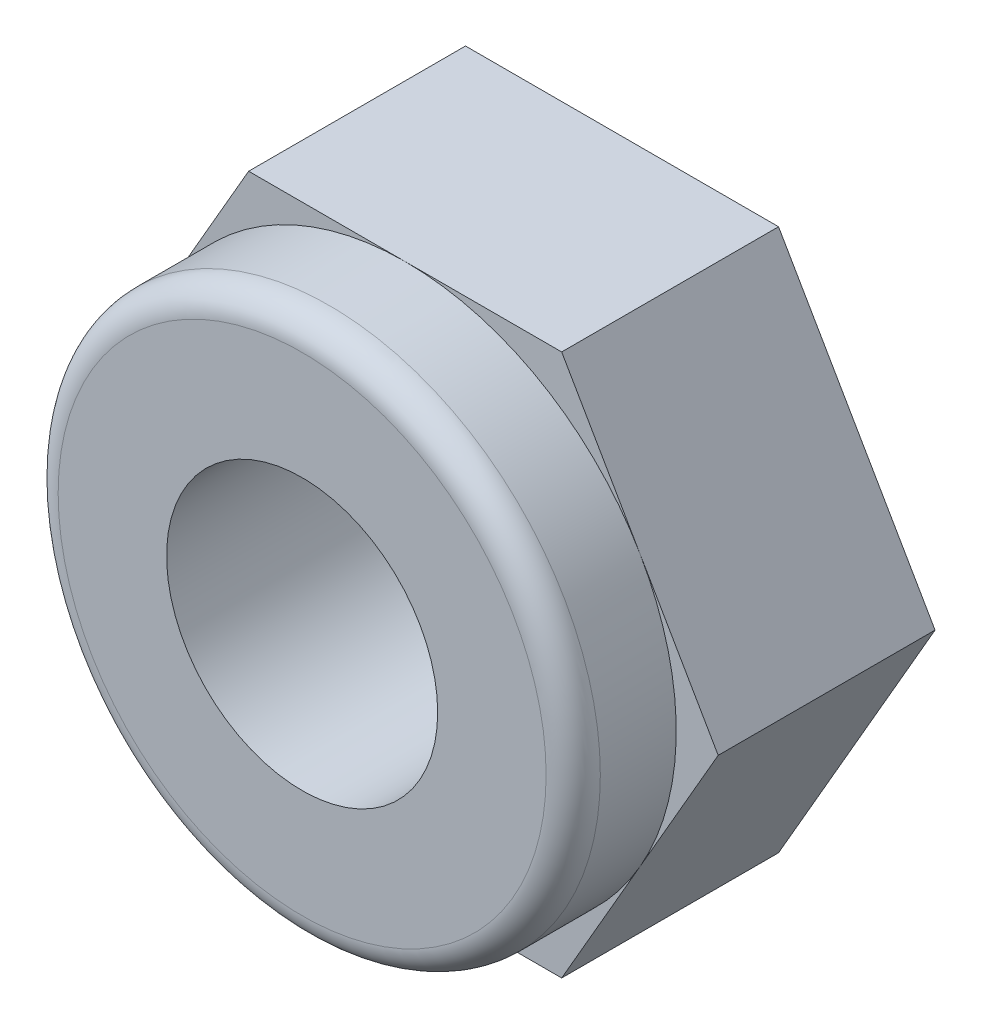
ISO-10303-21;
HEADER;
FILE_DESCRIPTION(('STEP AP214'),'2;1');
FILE_NAME('part.step','',(''),(''),'','','');
FILE_SCHEMA(('AUTOMOTIVE_DESIGN { 1 0 10303 214 1 1 1 1 }'));
ENDSEC;
DATA;
#1=APPLICATION_CONTEXT('core data for automotive mechanical design processes');
#2=APPLICATION_PROTOCOL_DEFINITION('international standard','automotive_design',2000,#1);
#3=PRODUCT_CONTEXT('',#1,'mechanical');
#4=PRODUCT('Part','Part','',(#3));
#5=PRODUCT_RELATED_PRODUCT_CATEGORY('part','',(#4));
#6=PRODUCT_DEFINITION_FORMATION('','',#4);
#7=PRODUCT_DEFINITION_CONTEXT('part definition',#1,'design');
#8=PRODUCT_DEFINITION('design','',#6,#7);
#9=PRODUCT_DEFINITION_SHAPE('','',#8);
#10=(LENGTH_UNIT() NAMED_UNIT(*) SI_UNIT(.MILLI.,.METRE.));
#11=(NAMED_UNIT(*) PLANE_ANGLE_UNIT() SI_UNIT($,.RADIAN.));
#12=(NAMED_UNIT(*) SI_UNIT($,.STERADIAN.) SOLID_ANGLE_UNIT());
#13=UNCERTAINTY_MEASURE_WITH_UNIT(LENGTH_MEASURE(1.E-05),#10,'distance_accuracy_value','');
#14=(GEOMETRIC_REPRESENTATION_CONTEXT(3) GLOBAL_UNCERTAINTY_ASSIGNED_CONTEXT((#13)) GLOBAL_UNIT_ASSIGNED_CONTEXT((#10,
#11,#12)) REPRESENTATION_CONTEXT('',''));
#15=CARTESIAN_POINT('',(0.,0.,0.));
#16=DIRECTION('',(0.,0.,1.));
#17=DIRECTION('',(1.,0.,0.));
#18=AXIS2_PLACEMENT_3D('',#15,#16,#17);
#19=CARTESIAN_POINT('',(0.,0.,4.));
#20=DIRECTION('',(0.,0.,1.));
#21=DIRECTION('',(1.,0.,0.));
#22=AXIS2_PLACEMENT_3D('',#19,#20,#21);
#23=PLANE('',#22);
#24=CARTESIAN_POINT('',(0.,0.,4.));
#25=DIRECTION('',(0.,0.,1.));
#26=DIRECTION('',(1.,0.,0.));
#27=AXIS2_PLACEMENT_3D('',#24,#25,#26);
#28=CIRCLE('',#27,5.);
#29=CARTESIAN_POINT('',(4.33012701892219,2.5,4.));
#30=VERTEX_POINT('',#29);
#31=CARTESIAN_POINT('',(0.,5.,4.));
#32=VERTEX_POINT('',#31);
#33=EDGE_CURVE('E139',#30,#32,#28,.T.);
#34=ORIENTED_EDGE('',*,*,#33,.F.);
#35=DIRECTION('',(-0.5,0.866025403784439,0.));
#36=VECTOR('',#35,1.);
#37=CARTESIAN_POINT('',(5.77350269189626,0.,4.));
#38=LINE('',#37,#36);
#39=CARTESIAN_POINT('',(2.88675134594813,5.,4.));
#40=VERTEX_POINT('',#39);
#41=EDGE_CURVE('E126',#30,#40,#38,.T.);
#42=ORIENTED_EDGE('',*,*,#41,.T.);
#43=DIRECTION('',(-1.,0.,0.));
#44=VECTOR('',#43,1.);
#45=CARTESIAN_POINT('',(2.88675134594813,5.,4.));
#46=LINE('',#45,#44);
#47=EDGE_CURVE('E140',#40,#32,#46,.T.);
#48=ORIENTED_EDGE('',*,*,#47,.T.);
#49=EDGE_LOOP('',(#34,#42,#48));
#50=FACE_BOUND('',#49,.T.);
#51=ADVANCED_FACE('F41',(#50),#23,.T.);
#52=CARTESIAN_POINT('',(-4.33012701892219,2.5,4.));
#53=VERTEX_POINT('',#52);
#54=EDGE_CURVE('E147',#32,#53,#28,.T.);
#55=ORIENTED_EDGE('',*,*,#54,.F.);
#56=CARTESIAN_POINT('',(-2.88675134594813,5.,4.));
#57=VERTEX_POINT('',#56);
#58=EDGE_CURVE('E125',#32,#57,#46,.T.);
#59=ORIENTED_EDGE('',*,*,#58,.T.);
#60=DIRECTION('',(-0.5,-0.866025403784439,0.));
#61=VECTOR('',#60,1.);
#62=CARTESIAN_POINT('',(-2.88675134594813,5.,4.));
#63=LINE('',#62,#61);
#64=EDGE_CURVE('E162',#57,#53,#63,.T.);
#65=ORIENTED_EDGE('',*,*,#64,.T.);
#66=EDGE_LOOP('',(#55,#59,#65));
#67=FACE_BOUND('',#66,.T.);
#68=ADVANCED_FACE('F229',(#67),#23,.T.);
#69=CARTESIAN_POINT('',(-4.3301270189222,-2.5,4.));
#70=VERTEX_POINT('',#69);
#71=EDGE_CURVE('E215',#53,#70,#28,.T.);
#72=ORIENTED_EDGE('',*,*,#71,.F.);
#73=CARTESIAN_POINT('',(-5.77350269189626,0.,4.));
#74=VERTEX_POINT('',#73);
#75=EDGE_CURVE('E161',#53,#74,#63,.T.);
#76=ORIENTED_EDGE('',*,*,#75,.T.);
#77=DIRECTION('',(0.5,-0.866025403784439,0.));
#78=VECTOR('',#77,1.);
#79=CARTESIAN_POINT('',(-5.77350269189626,0.,4.));
#80=LINE('',#79,#78);
#81=EDGE_CURVE('E167',#74,#70,#80,.T.);
#82=ORIENTED_EDGE('',*,*,#81,.T.);
#83=EDGE_LOOP('',(#72,#76,#82));
#84=FACE_BOUND('',#83,.T.);
#85=ADVANCED_FACE('F221',(#84),#23,.T.);
#86=CARTESIAN_POINT('',(0.,-5.,4.));
#87=VERTEX_POINT('',#86);
#88=EDGE_CURVE('E65',#70,#87,#28,.T.);
#89=ORIENTED_EDGE('',*,*,#88,.F.);
#90=CARTESIAN_POINT('',(-2.88675134594813,-5.,4.));
#91=VERTEX_POINT('',#90);
#92=EDGE_CURVE('E166',#70,#91,#80,.T.);
#93=ORIENTED_EDGE('',*,*,#92,.T.);
#94=DIRECTION('',(1.,0.,0.));
#95=VECTOR('',#94,1.);
#96=CARTESIAN_POINT('',(-2.88675134594813,-5.,4.));
#97=LINE('',#96,#95);
#98=EDGE_CURVE('E172',#91,#87,#97,.T.);
#99=ORIENTED_EDGE('',*,*,#98,.T.);
#100=EDGE_LOOP('',(#89,#93,#99));
#101=FACE_BOUND('',#100,.T.);
#102=ADVANCED_FACE('F249',(#101),#23,.T.);
#103=CARTESIAN_POINT('',(4.3301270189222,-2.5,4.));
#104=VERTEX_POINT('',#103);
#105=EDGE_CURVE('E57',#87,#104,#28,.T.);
#106=ORIENTED_EDGE('',*,*,#105,.F.);
#107=CARTESIAN_POINT('',(2.88675134594813,-5.,4.));
#108=VERTEX_POINT('',#107);
#109=EDGE_CURVE('E171',#87,#108,#97,.T.);
#110=ORIENTED_EDGE('',*,*,#109,.T.);
#111=DIRECTION('',(0.5,0.866025403784439,0.));
#112=VECTOR('',#111,1.);
#113=CARTESIAN_POINT('',(2.88675134594813,-5.,4.));
#114=LINE('',#113,#112);
#115=EDGE_CURVE('E137',#108,#104,#114,.T.);
#116=ORIENTED_EDGE('',*,*,#115,.T.);
#117=EDGE_LOOP('',(#106,#110,#116));
#118=FACE_BOUND('',#117,.T.);
#119=ADVANCED_FACE('F280',(#118),#23,.T.);
#120=CARTESIAN_POINT('',(2.88675134594813,-5.,4.));
#121=DIRECTION('',(-0.866025403784439,0.5,0.));
#122=DIRECTION('',(-0.5,-0.866025403784439,0.));
#123=AXIS2_PLACEMENT_3D('',#120,#121,#122);
#124=PLANE('',#123);
#125=DIRECTION('',(0.5,0.866025403784439,0.));
#126=VECTOR('',#125,1.);
#127=CARTESIAN_POINT('',(2.88675134594813,-5.,0.));
#128=LINE('',#127,#126);
#129=CARTESIAN_POINT('',(2.88675134594813,-5.,0.));
#130=VERTEX_POINT('',#129);
#131=CARTESIAN_POINT('',(5.77350269189626,0.,0.));
#132=VERTEX_POINT('',#131);
#133=EDGE_CURVE('E144',#130,#132,#128,.T.);
#134=ORIENTED_EDGE('',*,*,#133,.T.);
#135=DIRECTION('',(0.,0.,-1.));
#136=VECTOR('',#135,1.);
#137=CARTESIAN_POINT('',(5.77350269189626,0.,4.));
#138=LINE('',#137,#136);
#139=CARTESIAN_POINT('',(5.77350269189626,0.,4.));
#140=VERTEX_POINT('',#139);
#141=EDGE_CURVE('E150',#140,#132,#138,.T.);
#142=ORIENTED_EDGE('',*,*,#141,.F.);
#143=EDGE_CURVE('E120',#104,#140,#114,.T.);
#144=ORIENTED_EDGE('',*,*,#143,.F.);
#145=ORIENTED_EDGE('',*,*,#115,.F.);
#146=DIRECTION('',(0.,0.,-1.));
#147=VECTOR('',#146,1.);
#148=CARTESIAN_POINT('',(2.88675134594813,-5.,4.));
#149=LINE('',#148,#147);
#150=EDGE_CURVE('E175',#108,#130,#149,.T.);
#151=ORIENTED_EDGE('',*,*,#150,.T.);
#152=EDGE_LOOP('',(#134,#142,#144,#145,#151));
#153=FACE_BOUND('',#152,.T.);
#154=ADVANCED_FACE('F288',(#153),#124,.F.);
#155=CARTESIAN_POINT('',(5.77350269189626,0.,4.));
#156=DIRECTION('',(-0.866025403784439,-0.5,0.));
#157=DIRECTION('',(0.5,-0.866025403784439,0.));
#158=AXIS2_PLACEMENT_3D('',#155,#156,#157);
#159=PLANE('',#158);
#160=DIRECTION('',(-0.5,0.866025403784439,0.));
#161=VECTOR('',#160,1.);
#162=CARTESIAN_POINT('',(5.77350269189626,0.,0.));
#163=LINE('',#162,#161);
#164=CARTESIAN_POINT('',(2.88675134594813,5.,0.));
#165=VERTEX_POINT('',#164);
#166=EDGE_CURVE('E179',#132,#165,#163,.T.);
#167=ORIENTED_EDGE('',*,*,#166,.T.);
#168=DIRECTION('',(0.,0.,-1.));
#169=VECTOR('',#168,1.);
#170=CARTESIAN_POINT('',(2.88675134594813,5.,4.));
#171=LINE('',#170,#169);
#172=EDGE_CURVE('E132',#40,#165,#171,.T.);
#173=ORIENTED_EDGE('',*,*,#172,.F.);
#174=ORIENTED_EDGE('',*,*,#41,.F.);
#175=EDGE_CURVE('E114',#140,#30,#38,.T.);
#176=ORIENTED_EDGE('',*,*,#175,.F.);
#177=ORIENTED_EDGE('',*,*,#141,.T.);
#178=EDGE_LOOP('',(#167,#173,#174,#176,#177));
#179=FACE_BOUND('',#178,.T.);
#180=ADVANCED_FACE('F130',(#179),#159,.F.);
#181=CARTESIAN_POINT('',(2.88675134594813,5.,4.));
#182=DIRECTION('',(0.,-1.,0.));
#183=DIRECTION('',(0.,0.,-1.));
#184=AXIS2_PLACEMENT_3D('',#181,#182,#183);
#185=PLANE('',#184);
#186=DIRECTION('',(-1.,0.,0.));
#187=VECTOR('',#186,1.);
#188=CARTESIAN_POINT('',(2.88675134594813,5.,0.));
#189=LINE('',#188,#187);
#190=CARTESIAN_POINT('',(-2.88675134594813,5.,0.));
#191=VERTEX_POINT('',#190);
#192=EDGE_CURVE('E182',#165,#191,#189,.T.);
#193=ORIENTED_EDGE('',*,*,#192,.T.);
#194=DIRECTION('',(0.,0.,-1.));
#195=VECTOR('',#194,1.);
#196=CARTESIAN_POINT('',(-2.88675134594813,5.,4.));
#197=LINE('',#196,#195);
#198=EDGE_CURVE('E205',#57,#191,#197,.T.);
#199=ORIENTED_EDGE('',*,*,#198,.F.);
#200=ORIENTED_EDGE('',*,*,#58,.F.);
#201=ORIENTED_EDGE('',*,*,#47,.F.);
#202=ORIENTED_EDGE('',*,*,#172,.T.);
#203=EDGE_LOOP('',(#193,#199,#200,#201,#202));
#204=FACE_BOUND('',#203,.T.);
#205=ADVANCED_FACE('F234',(#204),#185,.F.);
#206=CARTESIAN_POINT('',(-2.88675134594813,5.,4.));
#207=DIRECTION('',(0.866025403784439,-0.5,0.));
#208=DIRECTION('',(0.5,0.866025403784439,0.));
#209=AXIS2_PLACEMENT_3D('',#206,#207,#208);
#210=PLANE('',#209);
#211=DIRECTION('',(-0.5,-0.866025403784439,0.));
#212=VECTOR('',#211,1.);
#213=CARTESIAN_POINT('',(-2.88675134594813,5.,0.));
#214=LINE('',#213,#212);
#215=CARTESIAN_POINT('',(-5.77350269189626,0.,0.));
#216=VERTEX_POINT('',#215);
#217=EDGE_CURVE('E185',#191,#216,#214,.T.);
#218=ORIENTED_EDGE('',*,*,#217,.T.);
#219=DIRECTION('',(0.,0.,-1.));
#220=VECTOR('',#219,1.);
#221=CARTESIAN_POINT('',(-5.77350269189626,0.,4.));
#222=LINE('',#221,#220);
#223=EDGE_CURVE('E201',#74,#216,#222,.T.);
#224=ORIENTED_EDGE('',*,*,#223,.F.);
#225=ORIENTED_EDGE('',*,*,#75,.F.);
#226=ORIENTED_EDGE('',*,*,#64,.F.);
#227=ORIENTED_EDGE('',*,*,#198,.T.);
#228=EDGE_LOOP('',(#218,#224,#225,#226,#227));
#229=FACE_BOUND('',#228,.T.);
#230=ADVANCED_FACE('F226',(#229),#210,.F.);
#231=CARTESIAN_POINT('',(-5.77350269189626,0.,4.));
#232=DIRECTION('',(0.866025403784439,0.5,0.));
#233=DIRECTION('',(-0.5,0.866025403784439,0.));
#234=AXIS2_PLACEMENT_3D('',#231,#232,#233);
#235=PLANE('',#234);
#236=DIRECTION('',(0.5,-0.866025403784439,0.));
#237=VECTOR('',#236,1.);
#238=CARTESIAN_POINT('',(-5.77350269189626,0.,0.));
#239=LINE('',#238,#237);
#240=CARTESIAN_POINT('',(-2.88675134594813,-5.,0.));
#241=VERTEX_POINT('',#240);
#242=EDGE_CURVE('E188',#216,#241,#239,.T.);
#243=ORIENTED_EDGE('',*,*,#242,.T.);
#244=DIRECTION('',(0.,0.,-1.));
#245=VECTOR('',#244,1.);
#246=CARTESIAN_POINT('',(-2.88675134594813,-5.,4.));
#247=LINE('',#246,#245);
#248=EDGE_CURVE('E197',#91,#241,#247,.T.);
#249=ORIENTED_EDGE('',*,*,#248,.F.);
#250=ORIENTED_EDGE('',*,*,#92,.F.);
#251=ORIENTED_EDGE('',*,*,#81,.F.);
#252=ORIENTED_EDGE('',*,*,#223,.T.);
#253=EDGE_LOOP('',(#243,#249,#250,#251,#252));
#254=FACE_BOUND('',#253,.T.);
#255=ADVANCED_FACE('F244',(#254),#235,.F.);
#256=CARTESIAN_POINT('',(-2.88675134594813,-5.,4.));
#257=DIRECTION('',(0.,1.,0.));
#258=DIRECTION('',(0.,0.,1.));
#259=AXIS2_PLACEMENT_3D('',#256,#257,#258);
#260=PLANE('',#259);
#261=DIRECTION('',(1.,0.,0.));
#262=VECTOR('',#261,1.);
#263=CARTESIAN_POINT('',(-2.88675134594813,-5.,0.));
#264=LINE('',#263,#262);
#265=EDGE_CURVE('E191',#241,#130,#264,.T.);
#266=ORIENTED_EDGE('',*,*,#265,.T.);
#267=ORIENTED_EDGE('',*,*,#150,.F.);
#268=ORIENTED_EDGE('',*,*,#109,.F.);
#269=ORIENTED_EDGE('',*,*,#98,.F.);
#270=ORIENTED_EDGE('',*,*,#248,.T.);
#271=EDGE_LOOP('',(#266,#267,#268,#269,#270));
#272=FACE_BOUND('',#271,.T.);
#273=ADVANCED_FACE('F247',(#272),#260,.F.);
#274=EDGE_CURVE('E118',#104,#30,#28,.T.);
#275=ORIENTED_EDGE('',*,*,#274,.F.);
#276=ORIENTED_EDGE('',*,*,#143,.T.);
#277=ORIENTED_EDGE('',*,*,#175,.T.);
#278=EDGE_LOOP('',(#275,#276,#277));
#279=FACE_BOUND('',#278,.T.);
#280=ADVANCED_FACE('F116',(#279),#23,.T.);
#281=CARTESIAN_POINT('',(0.,0.,0.));
#282=DIRECTION('',(0.,0.,1.));
#283=DIRECTION('',(1.,0.,0.));
#284=AXIS2_PLACEMENT_3D('',#281,#282,#283);
#285=PLANE('',#284);
#286=CARTESIAN_POINT('',(0.,0.,0.));
#287=DIRECTION('',(0.,0.,1.));
#288=DIRECTION('',(1.,0.,0.));
#289=AXIS2_PLACEMENT_3D('',#286,#287,#288);
#290=CIRCLE('',#289,2.5);
#291=CARTESIAN_POINT('',(2.5,0.,0.));
#292=VERTEX_POINT('',#291);
#293=EDGE_CURVE('E145',#292,#292,#290,.T.);
#294=ORIENTED_EDGE('',*,*,#293,.T.);
#295=EDGE_LOOP('',(#294));
#296=FACE_BOUND('',#295,.T.);
#297=ORIENTED_EDGE('',*,*,#133,.F.);
#298=ORIENTED_EDGE('',*,*,#265,.F.);
#299=ORIENTED_EDGE('',*,*,#242,.F.);
#300=ORIENTED_EDGE('',*,*,#217,.F.);
#301=ORIENTED_EDGE('',*,*,#192,.F.);
#302=ORIENTED_EDGE('',*,*,#166,.F.);
#303=EDGE_LOOP('',(#297,#298,#299,#300,#301,#302));
#304=FACE_BOUND('',#303,.T.);
#305=ADVANCED_FACE('F240',(#296,#304),#285,.F.);
#306=CARTESIAN_POINT('',(0.,0.,5.9));
#307=DIRECTION('',(0.,0.,-1.));
#308=DIRECTION('',(-1.,0.,0.));
#309=AXIS2_PLACEMENT_3D('',#306,#307,#308);
#310=CYLINDRICAL_SURFACE('',#309,5.);
#311=CARTESIAN_POINT('',(0.,0.,5.4));
#312=DIRECTION('',(0.,0.,1.));
#313=DIRECTION('',(1.,0.,0.));
#314=AXIS2_PLACEMENT_3D('',#311,#312,#313);
#315=CIRCLE('',#314,5.);
#316=CARTESIAN_POINT('',(5.,0.,5.4));
#317=VERTEX_POINT('',#316);
#318=EDGE_CURVE('E11',#317,#317,#315,.F.);
#319=ORIENTED_EDGE('',*,*,#318,.T.);
#320=EDGE_LOOP('',(#319));
#321=FACE_BOUND('',#320,.T.);
#322=ORIENTED_EDGE('',*,*,#33,.T.);
#323=ORIENTED_EDGE('',*,*,#54,.T.);
#324=ORIENTED_EDGE('',*,*,#71,.T.);
#325=ORIENTED_EDGE('',*,*,#88,.T.);
#326=ORIENTED_EDGE('',*,*,#105,.T.);
#327=ORIENTED_EDGE('',*,*,#274,.T.);
#328=EDGE_LOOP('',(#322,#323,#324,#325,#326,#327));
#329=FACE_BOUND('',#328,.T.);
#330=ADVANCED_FACE('F148',(#321,#329),#310,.T.);
#331=CARTESIAN_POINT('',(0.,0.,5.9));
#332=DIRECTION('',(0.,0.,1.));
#333=DIRECTION('',(1.,0.,0.));
#334=AXIS2_PLACEMENT_3D('',#331,#332,#333);
#335=PLANE('',#334);
#336=CARTESIAN_POINT('',(0.,0.,5.9));
#337=DIRECTION('',(0.,0.,1.));
#338=DIRECTION('',(1.,0.,0.));
#339=AXIS2_PLACEMENT_3D('',#336,#337,#338);
#340=CIRCLE('',#339,4.5);
#341=CARTESIAN_POINT('',(4.5,0.,5.9));
#342=VERTEX_POINT('',#341);
#343=EDGE_CURVE('E50',#342,#342,#340,.T.);
#344=ORIENTED_EDGE('',*,*,#343,.T.);
#345=EDGE_LOOP('',(#344));
#346=FACE_BOUND('',#345,.T.);
#347=CARTESIAN_POINT('',(0.,0.,5.9));
#348=DIRECTION('',(0.,0.,1.));
#349=DIRECTION('',(1.,0.,0.));
#350=AXIS2_PLACEMENT_3D('',#347,#348,#349);
#351=CIRCLE('',#350,2.5);
#352=CARTESIAN_POINT('',(2.5,0.,5.9));
#353=VERTEX_POINT('',#352);
#354=EDGE_CURVE('E256',#353,#353,#351,.T.);
#355=ORIENTED_EDGE('',*,*,#354,.F.);
#356=EDGE_LOOP('',(#355));
#357=FACE_BOUND('',#356,.T.);
#358=ADVANCED_FACE('F262',(#346,#357),#335,.T.);
#359=CARTESIAN_POINT('',(0.,0.,5.9));
#360=DIRECTION('',(0.,0.,1.));
#361=DIRECTION('',(1.,0.,0.));
#362=AXIS2_PLACEMENT_3D('',#359,#360,#361);
#363=CYLINDRICAL_SURFACE('',#362,2.5);
#364=ORIENTED_EDGE('',*,*,#293,.F.);
#365=EDGE_LOOP('',(#364));
#366=FACE_BOUND('',#365,.T.);
#367=ORIENTED_EDGE('',*,*,#354,.T.);
#368=EDGE_LOOP('',(#367));
#369=FACE_BOUND('',#368,.T.);
#370=ADVANCED_FACE('F260',(#366,#369),#363,.F.);
#371=CARTESIAN_POINT('',(0.,0.,5.4));
#372=DIRECTION('',(0.,0.,1.));
#373=DIRECTION('',(1.,0.,0.));
#374=AXIS2_PLACEMENT_3D('',#371,#372,#373);
#375=TOROIDAL_SURFACE('',#374,4.5,0.5);
#376=ORIENTED_EDGE('',*,*,#318,.F.);
#377=EDGE_LOOP('',(#376));
#378=FACE_BOUND('',#377,.T.);
#379=ORIENTED_EDGE('',*,*,#343,.F.);
#380=EDGE_LOOP('',(#379));
#381=FACE_BOUND('',#380,.T.);
#382=ADVANCED_FACE('F43',(#378,#381),#375,.T.);
#383=CLOSED_SHELL('',(#51,#68,#85,#102,#119,#154,#180,#205,#230,#255,#273,#280,#305,#330,#358,
#370,#382));
#384=MANIFOLD_SOLID_BREP('B2',#383);
#385=ADVANCED_BREP_SHAPE_REPRESENTATION('',(#18,#384),#14);
#386=SHAPE_DEFINITION_REPRESENTATION(#9,#385);
ENDSEC;
END-ISO-10303-21;
